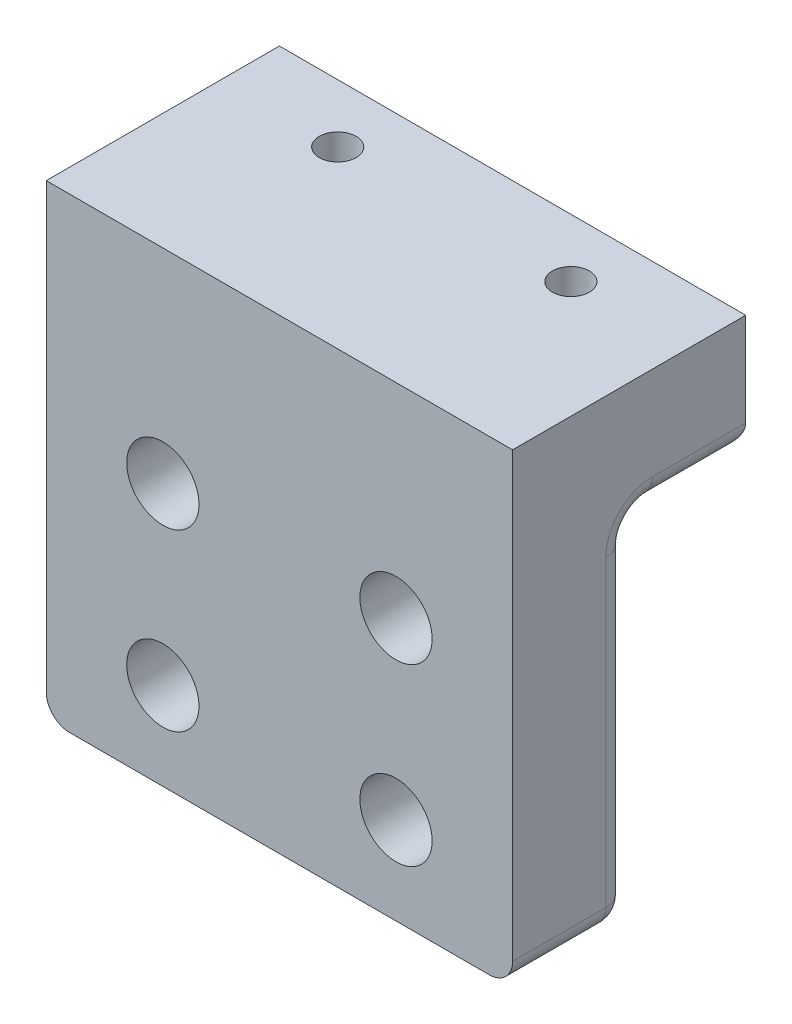
ISO-10303-21;
HEADER;
FILE_DESCRIPTION(('STEP AP214'),'2;1');
FILE_NAME('part.step','',(''),(''),'','','');
FILE_SCHEMA(('AUTOMOTIVE_DESIGN { 1 0 10303 214 1 1 1 1 }'));
ENDSEC;
DATA;
#1=APPLICATION_CONTEXT('core data for automotive mechanical design processes');
#2=APPLICATION_PROTOCOL_DEFINITION('international standard','automotive_design',2000,#1);
#3=PRODUCT_CONTEXT('',#1,'mechanical');
#4=PRODUCT('Part','Part','',(#3));
#5=PRODUCT_RELATED_PRODUCT_CATEGORY('part','',(#4));
#6=PRODUCT_DEFINITION_FORMATION('','',#4);
#7=PRODUCT_DEFINITION_CONTEXT('part definition',#1,'design');
#8=PRODUCT_DEFINITION('design','',#6,#7);
#9=PRODUCT_DEFINITION_SHAPE('','',#8);
#10=(LENGTH_UNIT() NAMED_UNIT(*) SI_UNIT(.MILLI.,.METRE.));
#11=(NAMED_UNIT(*) PLANE_ANGLE_UNIT() SI_UNIT($,.RADIAN.));
#12=(NAMED_UNIT(*) SI_UNIT($,.STERADIAN.) SOLID_ANGLE_UNIT());
#13=UNCERTAINTY_MEASURE_WITH_UNIT(LENGTH_MEASURE(1.E-05),#10,'distance_accuracy_value','');
#14=(GEOMETRIC_REPRESENTATION_CONTEXT(3) GLOBAL_UNCERTAINTY_ASSIGNED_CONTEXT((#13)) GLOBAL_UNIT_ASSIGNED_CONTEXT((#10,
#11,#12)) REPRESENTATION_CONTEXT('',''));
#15=CARTESIAN_POINT('',(0.,0.,0.));
#16=DIRECTION('',(0.,0.,1.));
#17=DIRECTION('',(1.,0.,0.));
#18=AXIS2_PLACEMENT_3D('',#15,#16,#17);
#19=CARTESIAN_POINT('',(0.,0.,5.));
#20=DIRECTION('',(0.,0.,1.));
#21=DIRECTION('',(1.,0.,0.));
#22=AXIS2_PLACEMENT_3D('',#19,#20,#21);
#23=PLANE('',#22);
#24=CARTESIAN_POINT('',(5.,-3.75,5.));
#25=DIRECTION('',(0.,0.,1.));
#26=DIRECTION('',(1.,0.,0.));
#27=AXIS2_PLACEMENT_3D('',#24,#25,#26);
#28=CIRCLE('',#27,1.55);
#29=CARTESIAN_POINT('',(6.55,-3.75,5.));
#30=VERTEX_POINT('',#29);
#31=EDGE_CURVE('E185',#30,#30,#28,.T.);
#32=ORIENTED_EDGE('',*,*,#31,.F.);
#33=EDGE_LOOP('',(#32));
#34=FACE_BOUND('',#33,.T.);
#35=CARTESIAN_POINT('',(-5.,3.75,5.));
#36=DIRECTION('',(0.,0.,1.));
#37=DIRECTION('',(1.,0.,0.));
#38=AXIS2_PLACEMENT_3D('',#35,#36,#37);
#39=CIRCLE('',#38,1.55);
#40=CARTESIAN_POINT('',(-3.45,3.75,5.));
#41=VERTEX_POINT('',#40);
#42=EDGE_CURVE('E147',#41,#41,#39,.T.);
#43=ORIENTED_EDGE('',*,*,#42,.F.);
#44=EDGE_LOOP('',(#43));
#45=FACE_BOUND('',#44,.T.);
#46=DIRECTION('',(1.,0.,0.));
#47=VECTOR('',#46,1.);
#48=CARTESIAN_POINT('',(10.,-7.5,5.));
#49=LINE('',#48,#47);
#50=CARTESIAN_POINT('',(-9.,-7.5,5.));
#51=VERTEX_POINT('',#50);
#52=CARTESIAN_POINT('',(9.,-7.5,5.));
#53=VERTEX_POINT('',#52);
#54=EDGE_CURVE('E146',#51,#53,#49,.T.);
#55=ORIENTED_EDGE('',*,*,#54,.T.);
#56=CARTESIAN_POINT('',(9.,-6.5,5.));
#57=DIRECTION('',(0.,0.,1.));
#58=DIRECTION('',(1.,0.,0.));
#59=AXIS2_PLACEMENT_3D('',#56,#57,#58);
#60=CIRCLE('',#59,1.);
#61=CARTESIAN_POINT('',(10.,-6.5,5.));
#62=VERTEX_POINT('',#61);
#63=EDGE_CURVE('E238',#53,#62,#60,.T.);
#64=ORIENTED_EDGE('',*,*,#63,.T.);
#65=DIRECTION('',(0.,1.,0.));
#66=VECTOR('',#65,1.);
#67=CARTESIAN_POINT('',(10.,-7.5,5.));
#68=LINE('',#67,#66);
#69=CARTESIAN_POINT('',(10.,12.5,5.));
#70=VERTEX_POINT('',#69);
#71=EDGE_CURVE('E154',#62,#70,#68,.T.);
#72=ORIENTED_EDGE('',*,*,#71,.T.);
#73=DIRECTION('',(1.,0.,0.));
#74=VECTOR('',#73,1.);
#75=CARTESIAN_POINT('',(-10.,12.5,5.));
#76=LINE('',#75,#74);
#77=CARTESIAN_POINT('',(-10.,12.5,5.));
#78=VERTEX_POINT('',#77);
#79=EDGE_CURVE('E150',#78,#70,#76,.T.);
#80=ORIENTED_EDGE('',*,*,#79,.F.);
#81=DIRECTION('',(0.,-1.,0.));
#82=VECTOR('',#81,1.);
#83=CARTESIAN_POINT('',(-10.,-7.5,5.));
#84=LINE('',#83,#82);
#85=CARTESIAN_POINT('',(-10.,-6.5,5.));
#86=VERTEX_POINT('',#85);
#87=EDGE_CURVE('E136',#78,#86,#84,.T.);
#88=ORIENTED_EDGE('',*,*,#87,.T.);
#89=CARTESIAN_POINT('',(-9.,-6.5,5.));
#90=DIRECTION('',(0.,0.,1.));
#91=DIRECTION('',(1.,0.,0.));
#92=AXIS2_PLACEMENT_3D('',#89,#90,#91);
#93=CIRCLE('',#92,1.);
#94=EDGE_CURVE('E236',#86,#51,#93,.T.);
#95=ORIENTED_EDGE('',*,*,#94,.T.);
#96=EDGE_LOOP('',(#55,#64,#72,#80,#88,#95));
#97=FACE_BOUND('',#96,.T.);
#98=CARTESIAN_POINT('',(5.,3.75,5.));
#99=DIRECTION('',(0.,0.,1.));
#100=DIRECTION('',(-1.,0.,0.));
#101=AXIS2_PLACEMENT_3D('',#98,#99,#100);
#102=CIRCLE('',#101,1.55);
#103=CARTESIAN_POINT('',(3.45,3.75,5.));
#104=VERTEX_POINT('',#103);
#105=EDGE_CURVE('E191',#104,#104,#102,.T.);
#106=ORIENTED_EDGE('',*,*,#105,.F.);
#107=EDGE_LOOP('',(#106));
#108=FACE_BOUND('',#107,.T.);
#109=CARTESIAN_POINT('',(-5.,-3.75,5.));
#110=DIRECTION('',(0.,0.,1.));
#111=DIRECTION('',(-1.,0.,0.));
#112=AXIS2_PLACEMENT_3D('',#109,#110,#111);
#113=CIRCLE('',#112,1.55);
#114=CARTESIAN_POINT('',(-6.55,-3.75,5.));
#115=VERTEX_POINT('',#114);
#116=EDGE_CURVE('E179',#115,#115,#113,.T.);
#117=ORIENTED_EDGE('',*,*,#116,.F.);
#118=EDGE_LOOP('',(#117));
#119=FACE_BOUND('',#118,.T.);
#120=ADVANCED_FACE('F38',(#34,#45,#97,#108,#119),#23,.T.);
#121=CARTESIAN_POINT('',(0.,0.,0.));
#122=DIRECTION('',(0.,0.,1.));
#123=DIRECTION('',(1.,0.,0.));
#124=AXIS2_PLACEMENT_3D('',#121,#122,#123);
#125=PLANE('',#124);
#126=DIRECTION('',(0.,1.,0.));
#127=VECTOR('',#126,1.);
#128=CARTESIAN_POINT('',(9.,0.,0.));
#129=LINE('',#128,#127);
#130=CARTESIAN_POINT('',(9.,6.5,0.));
#131=VERTEX_POINT('',#130);
#132=CARTESIAN_POINT('',(9.,-6.5,0.));
#133=VERTEX_POINT('',#132);
#134=EDGE_CURVE('E63',#131,#133,#129,.F.);
#135=ORIENTED_EDGE('',*,*,#134,.T.);
#136=DIRECTION('',(1.,0.,0.));
#137=VECTOR('',#136,1.);
#138=CARTESIAN_POINT('',(0.,-6.5,0.));
#139=LINE('',#138,#137);
#140=CARTESIAN_POINT('',(-9.,-6.5,0.));
#141=VERTEX_POINT('',#140);
#142=EDGE_CURVE('E47',#133,#141,#139,.F.);
#143=ORIENTED_EDGE('',*,*,#142,.T.);
#144=DIRECTION('',(0.,-1.,0.));
#145=VECTOR('',#144,1.);
#146=CARTESIAN_POINT('',(-9.,0.,0.));
#147=LINE('',#146,#145);
#148=CARTESIAN_POINT('',(-9.,6.5,0.));
#149=VERTEX_POINT('',#148);
#150=EDGE_CURVE('E55',#141,#149,#147,.F.);
#151=ORIENTED_EDGE('',*,*,#150,.T.);
#152=DIRECTION('',(-1.,0.,0.));
#153=VECTOR('',#152,1.);
#154=CARTESIAN_POINT('',(0.,6.5,0.));
#155=LINE('',#154,#153);
#156=EDGE_CURVE('E240',#149,#131,#155,.F.);
#157=ORIENTED_EDGE('',*,*,#156,.T.);
#158=EDGE_LOOP('',(#135,#143,#151,#157));
#159=FACE_BOUND('',#158,.T.);
#160=CARTESIAN_POINT('',(-5.,3.75,0.));
#161=DIRECTION('',(0.,0.,1.));
#162=DIRECTION('',(1.,0.,0.));
#163=AXIS2_PLACEMENT_3D('',#160,#161,#162);
#164=CIRCLE('',#163,1.55);
#165=CARTESIAN_POINT('',(-3.45,3.75,0.));
#166=VERTEX_POINT('',#165);
#167=EDGE_CURVE('E194',#166,#166,#164,.T.);
#168=ORIENTED_EDGE('',*,*,#167,.T.);
#169=EDGE_LOOP('',(#168));
#170=FACE_BOUND('',#169,.T.);
#171=CARTESIAN_POINT('',(5.,3.75,0.));
#172=DIRECTION('',(0.,0.,1.));
#173=DIRECTION('',(-1.,0.,0.));
#174=AXIS2_PLACEMENT_3D('',#171,#172,#173);
#175=CIRCLE('',#174,1.55);
#176=CARTESIAN_POINT('',(3.45,3.75,0.));
#177=VERTEX_POINT('',#176);
#178=EDGE_CURVE('E188',#177,#177,#175,.T.);
#179=ORIENTED_EDGE('',*,*,#178,.T.);
#180=EDGE_LOOP('',(#179));
#181=FACE_BOUND('',#180,.T.);
#182=CARTESIAN_POINT('',(5.,-3.75,0.));
#183=DIRECTION('',(0.,0.,1.));
#184=DIRECTION('',(1.,0.,0.));
#185=AXIS2_PLACEMENT_3D('',#182,#183,#184);
#186=CIRCLE('',#185,1.55);
#187=CARTESIAN_POINT('',(6.55,-3.75,0.));
#188=VERTEX_POINT('',#187);
#189=EDGE_CURVE('E182',#188,#188,#186,.T.);
#190=ORIENTED_EDGE('',*,*,#189,.T.);
#191=EDGE_LOOP('',(#190));
#192=FACE_BOUND('',#191,.T.);
#193=CARTESIAN_POINT('',(-5.,-3.75,0.));
#194=DIRECTION('',(0.,0.,1.));
#195=DIRECTION('',(-1.,0.,0.));
#196=AXIS2_PLACEMENT_3D('',#193,#194,#195);
#197=CIRCLE('',#196,1.55);
#198=CARTESIAN_POINT('',(-6.55,-3.75,0.));
#199=VERTEX_POINT('',#198);
#200=EDGE_CURVE('E178',#199,#199,#197,.T.);
#201=ORIENTED_EDGE('',*,*,#200,.T.);
#202=EDGE_LOOP('',(#201));
#203=FACE_BOUND('',#202,.T.);
#204=ADVANCED_FACE('F316',(#159,#170,#181,#192,#203),#125,.F.);
#205=CARTESIAN_POINT('',(-10.,-7.5,5.));
#206=DIRECTION('',(1.,0.,0.));
#207=DIRECTION('',(0.,1.,0.));
#208=AXIS2_PLACEMENT_3D('',#205,#206,#207);
#209=PLANE('',#208);
#210=DIRECTION('',(0.,-1.,0.));
#211=VECTOR('',#210,1.);
#212=CARTESIAN_POINT('',(-10.,12.5,-5.));
#213=LINE('',#212,#211);
#214=CARTESIAN_POINT('',(-10.,12.5,-5.));
#215=VERTEX_POINT('',#214);
#216=CARTESIAN_POINT('',(-10.,8.5,-5.));
#217=VERTEX_POINT('',#216);
#218=EDGE_CURVE('E173',#215,#217,#213,.T.);
#219=ORIENTED_EDGE('',*,*,#218,.T.);
#220=DIRECTION('',(0.,0.,1.));
#221=VECTOR('',#220,1.);
#222=CARTESIAN_POINT('',(-10.,8.5,0.));
#223=LINE('',#222,#221);
#224=CARTESIAN_POINT('',(-10.,8.5,-1.));
#225=VERTEX_POINT('',#224);
#226=EDGE_CURVE('E209',#217,#225,#223,.T.);
#227=ORIENTED_EDGE('',*,*,#226,.T.);
#228=CARTESIAN_POINT('',(-10.,6.5,-1.));
#229=DIRECTION('',(1.,0.,0.));
#230=DIRECTION('',(0.,1.,0.));
#231=AXIS2_PLACEMENT_3D('',#228,#229,#230);
#232=CIRCLE('',#231,2.);
#233=CARTESIAN_POINT('',(-10.,6.5,1.));
#234=VERTEX_POINT('',#233);
#235=EDGE_CURVE('E206',#234,#225,#232,.F.);
#236=ORIENTED_EDGE('',*,*,#235,.F.);
#237=DIRECTION('',(0.,-1.,0.));
#238=VECTOR('',#237,1.);
#239=CARTESIAN_POINT('',(-10.,-7.5,1.));
#240=LINE('',#239,#238);
#241=CARTESIAN_POINT('',(-10.,-6.5,1.));
#242=VERTEX_POINT('',#241);
#243=EDGE_CURVE('E203',#234,#242,#240,.T.);
#244=ORIENTED_EDGE('',*,*,#243,.T.);
#245=DIRECTION('',(0.,0.,-1.));
#246=VECTOR('',#245,1.);
#247=CARTESIAN_POINT('',(-10.,-6.5,5.));
#248=LINE('',#247,#246);
#249=EDGE_CURVE('E143',#242,#86,#248,.F.);
#250=ORIENTED_EDGE('',*,*,#249,.T.);
#251=ORIENTED_EDGE('',*,*,#87,.F.);
#252=DIRECTION('',(0.,0.,1.));
#253=VECTOR('',#252,1.);
#254=CARTESIAN_POINT('',(-10.,12.5,5.));
#255=LINE('',#254,#253);
#256=EDGE_CURVE('E141',#215,#78,#255,.T.);
#257=ORIENTED_EDGE('',*,*,#256,.F.);
#258=EDGE_LOOP('',(#219,#227,#236,#244,#250,#251,#257));
#259=FACE_BOUND('',#258,.T.);
#260=ADVANCED_FACE('F139',(#259),#209,.F.);
#261=CARTESIAN_POINT('',(10.,-7.5,5.));
#262=DIRECTION('',(0.,1.,0.));
#263=DIRECTION('',(0.,0.,1.));
#264=AXIS2_PLACEMENT_3D('',#261,#262,#263);
#265=PLANE('',#264);
#266=DIRECTION('',(1.,0.,0.));
#267=VECTOR('',#266,1.);
#268=CARTESIAN_POINT('',(10.,-7.5,1.));
#269=LINE('',#268,#267);
#270=CARTESIAN_POINT('',(-9.,-7.5,1.));
#271=VERTEX_POINT('',#270);
#272=CARTESIAN_POINT('',(9.,-7.5,1.));
#273=VERTEX_POINT('',#272);
#274=EDGE_CURVE('E230',#271,#273,#269,.T.);
#275=ORIENTED_EDGE('',*,*,#274,.T.);
#276=DIRECTION('',(0.,0.,-1.));
#277=VECTOR('',#276,1.);
#278=CARTESIAN_POINT('',(9.,-7.5,5.));
#279=LINE('',#278,#277);
#280=EDGE_CURVE('E234',#273,#53,#279,.F.);
#281=ORIENTED_EDGE('',*,*,#280,.T.);
#282=ORIENTED_EDGE('',*,*,#54,.F.);
#283=DIRECTION('',(0.,0.,-1.));
#284=VECTOR('',#283,1.);
#285=CARTESIAN_POINT('',(-9.,-7.5,5.));
#286=LINE('',#285,#284);
#287=EDGE_CURVE('E232',#51,#271,#286,.T.);
#288=ORIENTED_EDGE('',*,*,#287,.T.);
#289=EDGE_LOOP('',(#275,#281,#282,#288));
#290=FACE_BOUND('',#289,.T.);
#291=ADVANCED_FACE('F332',(#290),#265,.F.);
#292=CARTESIAN_POINT('',(10.,-7.5,5.));
#293=DIRECTION('',(-1.,0.,0.));
#294=DIRECTION('',(0.,-1.,0.));
#295=AXIS2_PLACEMENT_3D('',#292,#293,#294);
#296=PLANE('',#295);
#297=CARTESIAN_POINT('',(10.,6.5,-1.));
#298=DIRECTION('',(-1.,0.,0.));
#299=DIRECTION('',(0.,-1.,0.));
#300=AXIS2_PLACEMENT_3D('',#297,#298,#299);
#301=CIRCLE('',#300,2.);
#302=CARTESIAN_POINT('',(10.,8.5,-1.));
#303=VERTEX_POINT('',#302);
#304=CARTESIAN_POINT('',(10.,6.5,1.));
#305=VERTEX_POINT('',#304);
#306=EDGE_CURVE('E221',#303,#305,#301,.F.);
#307=ORIENTED_EDGE('',*,*,#306,.F.);
#308=DIRECTION('',(0.,0.,-1.));
#309=VECTOR('',#308,1.);
#310=CARTESIAN_POINT('',(10.,8.5,-5.));
#311=LINE('',#310,#309);
#312=CARTESIAN_POINT('',(10.,8.5,-5.));
#313=VERTEX_POINT('',#312);
#314=EDGE_CURVE('E228',#303,#313,#311,.T.);
#315=ORIENTED_EDGE('',*,*,#314,.T.);
#316=DIRECTION('',(0.,-1.,0.));
#317=VECTOR('',#316,1.);
#318=CARTESIAN_POINT('',(10.,12.5,-5.));
#319=LINE('',#318,#317);
#320=CARTESIAN_POINT('',(10.,12.5,-5.));
#321=VERTEX_POINT('',#320);
#322=EDGE_CURVE('E175',#321,#313,#319,.T.);
#323=ORIENTED_EDGE('',*,*,#322,.F.);
#324=DIRECTION('',(0.,0.,-1.));
#325=VECTOR('',#324,1.);
#326=CARTESIAN_POINT('',(10.,12.5,5.));
#327=LINE('',#326,#325);
#328=EDGE_CURVE('E157',#70,#321,#327,.T.);
#329=ORIENTED_EDGE('',*,*,#328,.F.);
#330=ORIENTED_EDGE('',*,*,#71,.F.);
#331=DIRECTION('',(0.,0.,-1.));
#332=VECTOR('',#331,1.);
#333=CARTESIAN_POINT('',(10.,-6.5,5.));
#334=LINE('',#333,#332);
#335=CARTESIAN_POINT('',(10.,-6.5,1.));
#336=VERTEX_POINT('',#335);
#337=EDGE_CURVE('E226',#62,#336,#334,.T.);
#338=ORIENTED_EDGE('',*,*,#337,.T.);
#339=DIRECTION('',(0.,1.,0.));
#340=VECTOR('',#339,1.);
#341=CARTESIAN_POINT('',(10.,-7.5,1.));
#342=LINE('',#341,#340);
#343=EDGE_CURVE('E224',#336,#305,#342,.T.);
#344=ORIENTED_EDGE('',*,*,#343,.T.);
#345=EDGE_LOOP('',(#307,#315,#323,#329,#330,#338,#344));
#346=FACE_BOUND('',#345,.T.);
#347=ADVANCED_FACE('F329',(#346),#296,.F.);
#348=CARTESIAN_POINT('',(-5.,3.75,5.));
#349=DIRECTION('',(0.,0.,-1.));
#350=DIRECTION('',(-1.,0.,0.));
#351=AXIS2_PLACEMENT_3D('',#348,#349,#350);
#352=CYLINDRICAL_SURFACE('',#351,1.55);
#353=ORIENTED_EDGE('',*,*,#42,.T.);
#354=EDGE_LOOP('',(#353));
#355=FACE_BOUND('',#354,.T.);
#356=ORIENTED_EDGE('',*,*,#167,.F.);
#357=EDGE_LOOP('',(#356));
#358=FACE_BOUND('',#357,.T.);
#359=ADVANCED_FACE('F326',(#355,#358),#352,.F.);
#360=CARTESIAN_POINT('',(5.,3.75,5.));
#361=DIRECTION('',(0.,0.,-1.));
#362=DIRECTION('',(-1.,0.,0.));
#363=AXIS2_PLACEMENT_3D('',#360,#361,#362);
#364=CYLINDRICAL_SURFACE('',#363,1.55);
#365=ORIENTED_EDGE('',*,*,#105,.T.);
#366=EDGE_LOOP('',(#365));
#367=FACE_BOUND('',#366,.T.);
#368=ORIENTED_EDGE('',*,*,#178,.F.);
#369=EDGE_LOOP('',(#368));
#370=FACE_BOUND('',#369,.T.);
#371=ADVANCED_FACE('F425',(#367,#370),#364,.F.);
#372=CARTESIAN_POINT('',(5.,-3.75,5.));
#373=DIRECTION('',(0.,0.,-1.));
#374=DIRECTION('',(-1.,0.,0.));
#375=AXIS2_PLACEMENT_3D('',#372,#373,#374);
#376=CYLINDRICAL_SURFACE('',#375,1.55);
#377=ORIENTED_EDGE('',*,*,#31,.T.);
#378=EDGE_LOOP('',(#377));
#379=FACE_BOUND('',#378,.T.);
#380=ORIENTED_EDGE('',*,*,#189,.F.);
#381=EDGE_LOOP('',(#380));
#382=FACE_BOUND('',#381,.T.);
#383=ADVANCED_FACE('F422',(#379,#382),#376,.F.);
#384=CARTESIAN_POINT('',(-5.,-3.75,5.));
#385=DIRECTION('',(0.,0.,-1.));
#386=DIRECTION('',(-1.,0.,0.));
#387=AXIS2_PLACEMENT_3D('',#384,#385,#386);
#388=CYLINDRICAL_SURFACE('',#387,1.55);
#389=ORIENTED_EDGE('',*,*,#116,.T.);
#390=EDGE_LOOP('',(#389));
#391=FACE_BOUND('',#390,.T.);
#392=ORIENTED_EDGE('',*,*,#200,.F.);
#393=EDGE_LOOP('',(#392));
#394=FACE_BOUND('',#393,.T.);
#395=ADVANCED_FACE('F418',(#391,#394),#388,.F.);
#396=CARTESIAN_POINT('',(0.,12.5,0.));
#397=DIRECTION('',(0.,-1.,0.));
#398=DIRECTION('',(0.,0.,-1.));
#399=AXIS2_PLACEMENT_3D('',#396,#397,#398);
#400=PLANE('',#399);
#401=ORIENTED_EDGE('',*,*,#256,.T.);
#402=ORIENTED_EDGE('',*,*,#79,.T.);
#403=ORIENTED_EDGE('',*,*,#328,.T.);
#404=DIRECTION('',(-1.,0.,0.));
#405=VECTOR('',#404,1.);
#406=CARTESIAN_POINT('',(-10.,12.5,-5.));
#407=LINE('',#406,#405);
#408=EDGE_CURVE('E162',#321,#215,#407,.T.);
#409=ORIENTED_EDGE('',*,*,#408,.T.);
#410=EDGE_LOOP('',(#401,#402,#403,#409));
#411=FACE_BOUND('',#410,.T.);
#412=CARTESIAN_POINT('',(-5.,12.5,-2.5));
#413=DIRECTION('',(0.,1.,0.));
#414=DIRECTION('',(0.,0.,1.));
#415=AXIS2_PLACEMENT_3D('',#412,#413,#414);
#416=CIRCLE('',#415,0.791259190515638);
#417=CARTESIAN_POINT('',(-5.,12.5,-1.70874080948436));
#418=VERTEX_POINT('',#417);
#419=EDGE_CURVE('E164',#418,#418,#416,.T.);
#420=ORIENTED_EDGE('',*,*,#419,.F.);
#421=EDGE_LOOP('',(#420));
#422=FACE_BOUND('',#421,.T.);
#423=CARTESIAN_POINT('',(5.,12.5,-2.49999999999999));
#424=DIRECTION('',(0.,1.,0.));
#425=DIRECTION('',(0.,0.,-1.));
#426=AXIS2_PLACEMENT_3D('',#423,#424,#425);
#427=CIRCLE('',#426,0.791259190515638);
#428=CARTESIAN_POINT('',(5.,12.5,-3.29125919051563));
#429=VERTEX_POINT('',#428);
#430=EDGE_CURVE('E288',#429,#429,#427,.T.);
#431=ORIENTED_EDGE('',*,*,#430,.F.);
#432=EDGE_LOOP('',(#431));
#433=FACE_BOUND('',#432,.T.);
#434=ADVANCED_FACE('F159',(#411,#422,#433),#400,.F.);
#435=CARTESIAN_POINT('',(0.,7.5,0.));
#436=DIRECTION('',(0.,-1.,0.));
#437=DIRECTION('',(0.,0.,-1.));
#438=AXIS2_PLACEMENT_3D('',#435,#436,#437);
#439=PLANE('',#438);
#440=DIRECTION('',(0.,0.,1.));
#441=VECTOR('',#440,1.);
#442=CARTESIAN_POINT('',(-9.,7.5,-5.));
#443=LINE('',#442,#441);
#444=CARTESIAN_POINT('',(-9.,7.5,-1.));
#445=VERTEX_POINT('',#444);
#446=CARTESIAN_POINT('',(-9.,7.5,-4.));
#447=VERTEX_POINT('',#446);
#448=EDGE_CURVE('E216',#445,#447,#443,.F.);
#449=ORIENTED_EDGE('',*,*,#448,.T.);
#450=DIRECTION('',(-1.,0.,0.));
#451=VECTOR('',#450,1.);
#452=CARTESIAN_POINT('',(10.,7.5,-4.));
#453=LINE('',#452,#451);
#454=CARTESIAN_POINT('',(9.,7.5,-4.));
#455=VERTEX_POINT('',#454);
#456=EDGE_CURVE('E219',#447,#455,#453,.F.);
#457=ORIENTED_EDGE('',*,*,#456,.T.);
#458=DIRECTION('',(0.,0.,-1.));
#459=VECTOR('',#458,1.);
#460=CARTESIAN_POINT('',(9.,7.5,0.));
#461=LINE('',#460,#459);
#462=CARTESIAN_POINT('',(9.,7.5,-1.));
#463=VERTEX_POINT('',#462);
#464=EDGE_CURVE('E214',#455,#463,#461,.F.);
#465=ORIENTED_EDGE('',*,*,#464,.T.);
#466=DIRECTION('',(-1.,0.,0.));
#467=VECTOR('',#466,1.);
#468=CARTESIAN_POINT('',(0.,7.5,-1.));
#469=LINE('',#468,#467);
#470=EDGE_CURVE('E212',#463,#445,#469,.T.);
#471=ORIENTED_EDGE('',*,*,#470,.T.);
#472=EDGE_LOOP('',(#449,#457,#465,#471));
#473=FACE_BOUND('',#472,.T.);
#474=CARTESIAN_POINT('',(-5.,7.5,-2.5));
#475=DIRECTION('',(0.,1.,0.));
#476=DIRECTION('',(0.,0.,1.));
#477=AXIS2_PLACEMENT_3D('',#474,#475,#476);
#478=CIRCLE('',#477,0.791259190515638);
#479=CARTESIAN_POINT('',(-5.,7.5,-1.70874080948436));
#480=VERTEX_POINT('',#479);
#481=EDGE_CURVE('E167',#480,#480,#478,.T.);
#482=ORIENTED_EDGE('',*,*,#481,.T.);
#483=EDGE_LOOP('',(#482));
#484=FACE_BOUND('',#483,.T.);
#485=CARTESIAN_POINT('',(5.,7.5,-2.49999999999999));
#486=DIRECTION('',(0.,1.,0.));
#487=DIRECTION('',(0.,0.,-1.));
#488=AXIS2_PLACEMENT_3D('',#485,#486,#487);
#489=CIRCLE('',#488,0.791259190515638);
#490=CARTESIAN_POINT('',(5.,7.5,-3.29125919051563));
#491=VERTEX_POINT('',#490);
#492=EDGE_CURVE('E283',#491,#491,#489,.T.);
#493=ORIENTED_EDGE('',*,*,#492,.T.);
#494=EDGE_LOOP('',(#493));
#495=FACE_BOUND('',#494,.T.);
#496=ADVANCED_FACE('F299',(#473,#484,#495),#439,.T.);
#497=CARTESIAN_POINT('',(-10.,12.5,-5.));
#498=DIRECTION('',(0.,0.,1.));
#499=DIRECTION('',(1.,0.,0.));
#500=AXIS2_PLACEMENT_3D('',#497,#498,#499);
#501=PLANE('',#500);
#502=ORIENTED_EDGE('',*,*,#322,.T.);
#503=DIRECTION('',(-1.,0.,0.));
#504=VECTOR('',#503,1.);
#505=CARTESIAN_POINT('',(-10.,8.5,-5.));
#506=LINE('',#505,#504);
#507=EDGE_CURVE('E11',#313,#217,#506,.T.);
#508=ORIENTED_EDGE('',*,*,#507,.T.);
#509=ORIENTED_EDGE('',*,*,#218,.F.);
#510=ORIENTED_EDGE('',*,*,#408,.F.);
#511=EDGE_LOOP('',(#502,#508,#509,#510));
#512=FACE_BOUND('',#511,.T.);
#513=ADVANCED_FACE('F304',(#512),#501,.F.);
#514=CARTESIAN_POINT('',(-5.,12.5,-2.5));
#515=DIRECTION('',(0.,-1.,0.));
#516=DIRECTION('',(0.,0.,-1.));
#517=AXIS2_PLACEMENT_3D('',#514,#515,#516);
#518=CYLINDRICAL_SURFACE('',#517,0.791259190515638);
#519=ORIENTED_EDGE('',*,*,#419,.T.);
#520=EDGE_LOOP('',(#519));
#521=FACE_BOUND('',#520,.T.);
#522=ORIENTED_EDGE('',*,*,#481,.F.);
#523=EDGE_LOOP('',(#522));
#524=FACE_BOUND('',#523,.T.);
#525=ADVANCED_FACE('F301',(#521,#524),#518,.F.);
#526=CARTESIAN_POINT('',(5.,12.5,-2.49999999999999));
#527=DIRECTION('',(0.,-1.,0.));
#528=DIRECTION('',(0.,0.,-1.));
#529=AXIS2_PLACEMENT_3D('',#526,#527,#528);
#530=CYLINDRICAL_SURFACE('',#529,0.791259190515638);
#531=ORIENTED_EDGE('',*,*,#430,.T.);
#532=EDGE_LOOP('',(#531));
#533=FACE_BOUND('',#532,.T.);
#534=ORIENTED_EDGE('',*,*,#492,.F.);
#535=EDGE_LOOP('',(#534));
#536=FACE_BOUND('',#535,.T.);
#537=ADVANCED_FACE('F303',(#533,#536),#530,.F.);
#538=CARTESIAN_POINT('',(9.,-6.5,5.));
#539=DIRECTION('',(0.,0.,-1.));
#540=DIRECTION('',(-1.,0.,0.));
#541=AXIS2_PLACEMENT_3D('',#538,#539,#540);
#542=CYLINDRICAL_SURFACE('',#541,1.);
#543=CARTESIAN_POINT('',(9.,-6.5,1.));
#544=DIRECTION('',(0.,0.,-1.));
#545=DIRECTION('',(-1.,0.,0.));
#546=AXIS2_PLACEMENT_3D('',#543,#544,#545);
#547=CIRCLE('',#546,1.);
#548=EDGE_CURVE('E42',#336,#273,#547,.T.);
#549=ORIENTED_EDGE('',*,*,#548,.F.);
#550=ORIENTED_EDGE('',*,*,#337,.F.);
#551=ORIENTED_EDGE('',*,*,#63,.F.);
#552=ORIENTED_EDGE('',*,*,#280,.F.);
#553=EDGE_LOOP('',(#549,#550,#551,#552));
#554=FACE_BOUND('',#553,.T.);
#555=ADVANCED_FACE('F40',(#554),#542,.T.);
#556=CARTESIAN_POINT('',(9.,-6.5,1.));
#557=DIRECTION('',(0.,-1.,0.));
#558=DIRECTION('',(0.,0.,-1.));
#559=AXIS2_PLACEMENT_3D('',#556,#557,#558);
#560=SPHERICAL_SURFACE('',#559,1.);
#561=CARTESIAN_POINT('',(9.,-6.5,1.));
#562=DIRECTION('',(0.,-1.,0.));
#563=DIRECTION('',(0.,0.,-1.));
#564=AXIS2_PLACEMENT_3D('',#561,#562,#563);
#565=CIRCLE('',#564,1.);
#566=EDGE_CURVE('E275',#336,#133,#565,.F.);
#567=ORIENTED_EDGE('',*,*,#566,.F.);
#568=ORIENTED_EDGE('',*,*,#548,.T.);
#569=CARTESIAN_POINT('',(9.,-6.5,1.));
#570=DIRECTION('',(1.,0.,0.));
#571=DIRECTION('',(0.,0.,-1.));
#572=AXIS2_PLACEMENT_3D('',#569,#570,#571);
#573=CIRCLE('',#572,1.);
#574=EDGE_CURVE('E276',#133,#273,#573,.F.);
#575=ORIENTED_EDGE('',*,*,#574,.F.);
#576=EDGE_LOOP('',(#567,#568,#575));
#577=FACE_BOUND('',#576,.T.);
#578=ADVANCED_FACE('F379',(#577),#560,.T.);
#579=CARTESIAN_POINT('',(-9.,-6.5,5.));
#580=DIRECTION('',(0.,0.,-1.));
#581=DIRECTION('',(-1.,0.,0.));
#582=AXIS2_PLACEMENT_3D('',#579,#580,#581);
#583=CYLINDRICAL_SURFACE('',#582,1.);
#584=ORIENTED_EDGE('',*,*,#94,.F.);
#585=ORIENTED_EDGE('',*,*,#249,.F.);
#586=CARTESIAN_POINT('',(-9.,-6.5,1.));
#587=DIRECTION('',(0.,0.,-1.));
#588=DIRECTION('',(-1.,0.,0.));
#589=AXIS2_PLACEMENT_3D('',#586,#587,#588);
#590=CIRCLE('',#589,1.);
#591=EDGE_CURVE('E272',#271,#242,#590,.T.);
#592=ORIENTED_EDGE('',*,*,#591,.F.);
#593=ORIENTED_EDGE('',*,*,#287,.F.);
#594=EDGE_LOOP('',(#584,#585,#592,#593));
#595=FACE_BOUND('',#594,.T.);
#596=ADVANCED_FACE('F377',(#595),#583,.T.);
#597=CARTESIAN_POINT('',(10.,-6.5,1.));
#598=DIRECTION('',(1.,0.,0.));
#599=DIRECTION('',(0.,0.,-1.));
#600=AXIS2_PLACEMENT_3D('',#597,#598,#599);
#601=CYLINDRICAL_SURFACE('',#600,1.);
#602=ORIENTED_EDGE('',*,*,#574,.T.);
#603=ORIENTED_EDGE('',*,*,#274,.F.);
#604=CARTESIAN_POINT('',(-9.,-6.5,1.));
#605=DIRECTION('',(-1.,0.,0.));
#606=DIRECTION('',(0.,0.,1.));
#607=AXIS2_PLACEMENT_3D('',#604,#605,#606);
#608=CIRCLE('',#607,1.);
#609=EDGE_CURVE('E269',#141,#271,#608,.T.);
#610=ORIENTED_EDGE('',*,*,#609,.F.);
#611=ORIENTED_EDGE('',*,*,#142,.F.);
#612=EDGE_LOOP('',(#602,#603,#610,#611));
#613=FACE_BOUND('',#612,.T.);
#614=ADVANCED_FACE('F373',(#613),#601,.T.);
#615=CARTESIAN_POINT('',(9.,-7.5,1.));
#616=DIRECTION('',(0.,1.,0.));
#617=DIRECTION('',(-1.,0.,0.));
#618=AXIS2_PLACEMENT_3D('',#615,#616,#617);
#619=CYLINDRICAL_SURFACE('',#618,1.);
#620=ORIENTED_EDGE('',*,*,#566,.T.);
#621=ORIENTED_EDGE('',*,*,#134,.F.);
#622=CARTESIAN_POINT('',(9.,6.5,1.));
#623=DIRECTION('',(0.,1.,0.));
#624=DIRECTION('',(0.,0.,1.));
#625=AXIS2_PLACEMENT_3D('',#622,#623,#624);
#626=CIRCLE('',#625,1.);
#627=EDGE_CURVE('E266',#305,#131,#626,.T.);
#628=ORIENTED_EDGE('',*,*,#627,.F.);
#629=ORIENTED_EDGE('',*,*,#343,.F.);
#630=EDGE_LOOP('',(#620,#621,#628,#629));
#631=FACE_BOUND('',#630,.T.);
#632=ADVANCED_FACE('F369',(#631),#619,.T.);
#633=CARTESIAN_POINT('',(-9.,-6.5,1.));
#634=DIRECTION('',(0.,-1.,0.));
#635=DIRECTION('',(0.,0.,-1.));
#636=AXIS2_PLACEMENT_3D('',#633,#634,#635);
#637=SPHERICAL_SURFACE('',#636,1.);
#638=ORIENTED_EDGE('',*,*,#609,.T.);
#639=ORIENTED_EDGE('',*,*,#591,.T.);
#640=CARTESIAN_POINT('',(-9.,-6.5,1.));
#641=DIRECTION('',(0.,-1.,0.));
#642=DIRECTION('',(0.,0.,-1.));
#643=AXIS2_PLACEMENT_3D('',#640,#641,#642);
#644=CIRCLE('',#643,1.);
#645=EDGE_CURVE('E261',#141,#242,#644,.F.);
#646=ORIENTED_EDGE('',*,*,#645,.F.);
#647=EDGE_LOOP('',(#638,#639,#646));
#648=FACE_BOUND('',#647,.T.);
#649=ADVANCED_FACE('F365',(#648),#637,.T.);
#650=CARTESIAN_POINT('',(9.,6.5,-1.));
#651=DIRECTION('',(-1.,0.,0.));
#652=DIRECTION('',(0.,-1.,0.));
#653=AXIS2_PLACEMENT_3D('',#650,#651,#652);
#654=TOROIDAL_SURFACE('',#653,2.,1.);
#655=CARTESIAN_POINT('',(9.,6.5,-1.));
#656=DIRECTION('',(-1.,0.,0.));
#657=DIRECTION('',(0.,-1.,0.));
#658=AXIS2_PLACEMENT_3D('',#655,#656,#657);
#659=CIRCLE('',#658,1.);
#660=EDGE_CURVE('E258',#463,#131,#659,.F.);
#661=ORIENTED_EDGE('',*,*,#660,.F.);
#662=CARTESIAN_POINT('',(9.,8.5,-1.));
#663=DIRECTION('',(0.,0.,1.));
#664=DIRECTION('',(1.,0.,0.));
#665=AXIS2_PLACEMENT_3D('',#662,#663,#664);
#666=CIRCLE('',#665,1.);
#667=EDGE_CURVE('E263',#303,#463,#666,.F.);
#668=ORIENTED_EDGE('',*,*,#667,.F.);
#669=ORIENTED_EDGE('',*,*,#306,.T.);
#670=ORIENTED_EDGE('',*,*,#627,.T.);
#671=EDGE_LOOP('',(#661,#668,#669,#670));
#672=FACE_BOUND('',#671,.T.);
#673=ADVANCED_FACE('F361',(#672),#654,.T.);
#674=CARTESIAN_POINT('',(9.,8.5,5.));
#675=DIRECTION('',(0.,0.,1.));
#676=DIRECTION('',(1.,0.,0.));
#677=AXIS2_PLACEMENT_3D('',#674,#675,#676);
#678=CYLINDRICAL_SURFACE('',#677,1.);
#679=ORIENTED_EDGE('',*,*,#667,.T.);
#680=ORIENTED_EDGE('',*,*,#464,.F.);
#681=CARTESIAN_POINT('',(9.,8.5,-4.));
#682=DIRECTION('',(0.707106781186547,0.,0.707106781186547));
#683=DIRECTION('',(0.707106781186547,0.,-0.707106781186547));
#684=AXIS2_PLACEMENT_3D('',#681,#682,#683);
#685=ELLIPSE('',#684,1.41421356237309,1.);
#686=EDGE_CURVE('E255',#313,#455,#685,.F.);
#687=ORIENTED_EDGE('',*,*,#686,.F.);
#688=ORIENTED_EDGE('',*,*,#314,.F.);
#689=EDGE_LOOP('',(#679,#680,#687,#688));
#690=FACE_BOUND('',#689,.T.);
#691=ADVANCED_FACE('F358',(#690),#678,.T.);
#692=CARTESIAN_POINT('',(-9.,-7.5,1.));
#693=DIRECTION('',(0.,-1.,0.));
#694=DIRECTION('',(1.,0.,0.));
#695=AXIS2_PLACEMENT_3D('',#692,#693,#694);
#696=CYLINDRICAL_SURFACE('',#695,1.);
#697=ORIENTED_EDGE('',*,*,#645,.T.);
#698=ORIENTED_EDGE('',*,*,#243,.F.);
#699=CARTESIAN_POINT('',(-9.,6.5,1.));
#700=DIRECTION('',(0.,1.,0.));
#701=DIRECTION('',(0.,0.,1.));
#702=AXIS2_PLACEMENT_3D('',#699,#700,#701);
#703=CIRCLE('',#702,1.);
#704=EDGE_CURVE('E252',#149,#234,#703,.T.);
#705=ORIENTED_EDGE('',*,*,#704,.F.);
#706=ORIENTED_EDGE('',*,*,#150,.F.);
#707=EDGE_LOOP('',(#697,#698,#705,#706));
#708=FACE_BOUND('',#707,.T.);
#709=ADVANCED_FACE('F354',(#708),#696,.T.);
#710=CARTESIAN_POINT('',(0.,6.5,-1.));
#711=DIRECTION('',(-1.,0.,0.));
#712=DIRECTION('',(0.,0.,1.));
#713=AXIS2_PLACEMENT_3D('',#710,#711,#712);
#714=CYLINDRICAL_SURFACE('',#713,1.);
#715=ORIENTED_EDGE('',*,*,#660,.T.);
#716=ORIENTED_EDGE('',*,*,#156,.F.);
#717=CARTESIAN_POINT('',(-9.,6.5,-1.));
#718=DIRECTION('',(1.,0.,0.));
#719=DIRECTION('',(0.,1.,0.));
#720=AXIS2_PLACEMENT_3D('',#717,#718,#719);
#721=CIRCLE('',#720,1.);
#722=EDGE_CURVE('E249',#445,#149,#721,.T.);
#723=ORIENTED_EDGE('',*,*,#722,.F.);
#724=ORIENTED_EDGE('',*,*,#470,.F.);
#725=EDGE_LOOP('',(#715,#716,#723,#724));
#726=FACE_BOUND('',#725,.T.);
#727=ADVANCED_FACE('F350',(#726),#714,.F.);
#728=CARTESIAN_POINT('',(-10.,8.5,-4.));
#729=DIRECTION('',(1.,0.,0.));
#730=DIRECTION('',(0.,0.,-1.));
#731=AXIS2_PLACEMENT_3D('',#728,#729,#730);
#732=CYLINDRICAL_SURFACE('',#731,1.);
#733=ORIENTED_EDGE('',*,*,#686,.T.);
#734=ORIENTED_EDGE('',*,*,#456,.F.);
#735=CARTESIAN_POINT('',(-9.,8.5,-4.));
#736=DIRECTION('',(0.707106781186547,0.,-0.707106781186547));
#737=DIRECTION('',(0.707106781186547,0.,0.707106781186547));
#738=AXIS2_PLACEMENT_3D('',#735,#736,#737);
#739=ELLIPSE('',#738,1.41421356237309,1.);
#740=EDGE_CURVE('E247',#217,#447,#739,.F.);
#741=ORIENTED_EDGE('',*,*,#740,.F.);
#742=ORIENTED_EDGE('',*,*,#507,.F.);
#743=EDGE_LOOP('',(#733,#734,#741,#742));
#744=FACE_BOUND('',#743,.T.);
#745=ADVANCED_FACE('F346',(#744),#732,.T.);
#746=CARTESIAN_POINT('',(-9.,6.5,-1.));
#747=DIRECTION('',(1.,0.,0.));
#748=DIRECTION('',(0.,1.,0.));
#749=AXIS2_PLACEMENT_3D('',#746,#747,#748);
#750=TOROIDAL_SURFACE('',#749,2.,1.);
#751=ORIENTED_EDGE('',*,*,#704,.T.);
#752=ORIENTED_EDGE('',*,*,#235,.T.);
#753=CARTESIAN_POINT('',(-9.,8.5,-1.));
#754=DIRECTION('',(0.,0.,1.));
#755=DIRECTION('',(1.,0.,0.));
#756=AXIS2_PLACEMENT_3D('',#753,#754,#755);
#757=CIRCLE('',#756,1.);
#758=EDGE_CURVE('E245',#445,#225,#757,.F.);
#759=ORIENTED_EDGE('',*,*,#758,.F.);
#760=ORIENTED_EDGE('',*,*,#722,.T.);
#761=EDGE_LOOP('',(#751,#752,#759,#760));
#762=FACE_BOUND('',#761,.T.);
#763=ADVANCED_FACE('F342',(#762),#750,.T.);
#764=CARTESIAN_POINT('',(-9.,8.5,5.));
#765=DIRECTION('',(0.,0.,-1.));
#766=DIRECTION('',(-1.,0.,0.));
#767=AXIS2_PLACEMENT_3D('',#764,#765,#766);
#768=CYLINDRICAL_SURFACE('',#767,1.);
#769=ORIENTED_EDGE('',*,*,#740,.T.);
#770=ORIENTED_EDGE('',*,*,#448,.F.);
#771=ORIENTED_EDGE('',*,*,#758,.T.);
#772=ORIENTED_EDGE('',*,*,#226,.F.);
#773=EDGE_LOOP('',(#769,#770,#771,#772));
#774=FACE_BOUND('',#773,.T.);
#775=ADVANCED_FACE('F339',(#774),#768,.T.);
#776=CLOSED_SHELL('',(#120,#204,#260,#291,#347,#359,#371,#383,#395,#434,#496,#513,#525,#537,
#555,#578,#596,#614,#632,#649,#673,#691,#709,#727,#745,#763,#775));
#777=MANIFOLD_SOLID_BREP('B2',#776);
#778=ADVANCED_BREP_SHAPE_REPRESENTATION('',(#18,#777),#14);
#779=SHAPE_DEFINITION_REPRESENTATION(#9,#778);
ENDSEC;
END-ISO-10303-21;
